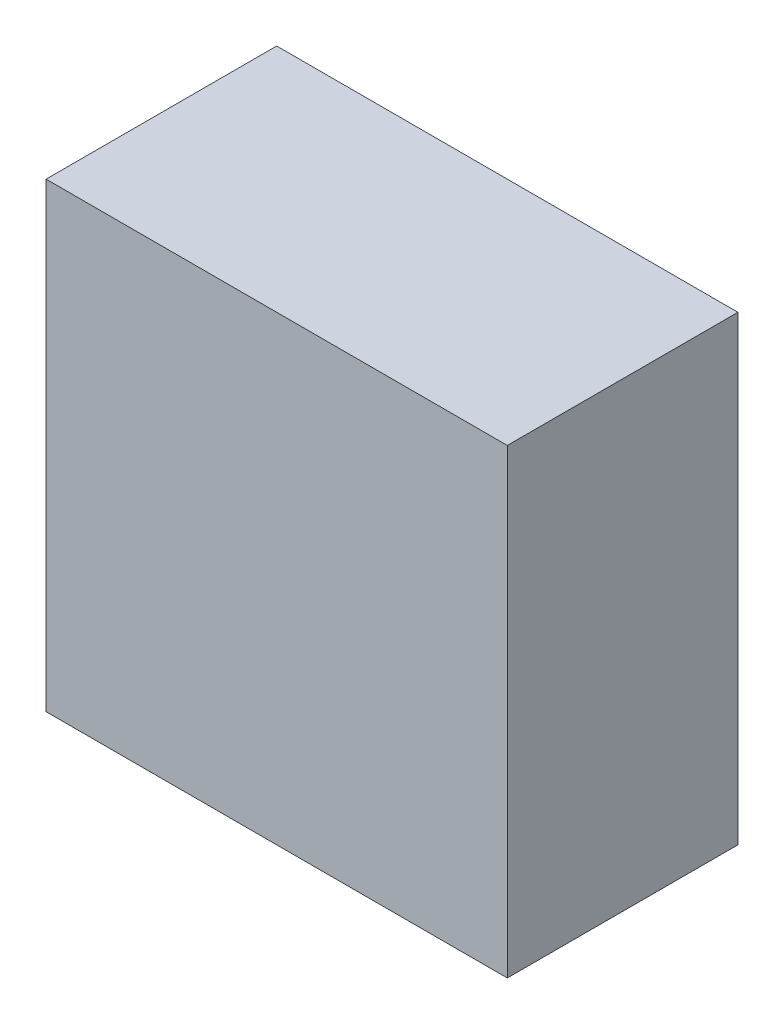
ISO-10303-21;
HEADER;
FILE_DESCRIPTION(('STEP AP214'),'2;1');
FILE_NAME('part.step','',(''),(''),'','','');
FILE_SCHEMA(('AUTOMOTIVE_DESIGN { 1 0 10303 214 1 1 1 1 }'));
ENDSEC;
DATA;
#1=APPLICATION_CONTEXT('core data for automotive mechanical design processes');
#2=APPLICATION_PROTOCOL_DEFINITION('international standard','automotive_design',2000,#1);
#3=PRODUCT_CONTEXT('',#1,'mechanical');
#4=PRODUCT('Part','Part','',(#3));
#5=PRODUCT_RELATED_PRODUCT_CATEGORY('part','',(#4));
#6=PRODUCT_DEFINITION_FORMATION('','',#4);
#7=PRODUCT_DEFINITION_CONTEXT('part definition',#1,'design');
#8=PRODUCT_DEFINITION('design','',#6,#7);
#9=PRODUCT_DEFINITION_SHAPE('','',#8);
#10=(LENGTH_UNIT() NAMED_UNIT(*) SI_UNIT(.MILLI.,.METRE.));
#11=(NAMED_UNIT(*) PLANE_ANGLE_UNIT() SI_UNIT($,.RADIAN.));
#12=(NAMED_UNIT(*) SI_UNIT($,.STERADIAN.) SOLID_ANGLE_UNIT());
#13=UNCERTAINTY_MEASURE_WITH_UNIT(LENGTH_MEASURE(1.E-05),#10,'distance_accuracy_value','');
#14=(GEOMETRIC_REPRESENTATION_CONTEXT(3) GLOBAL_UNCERTAINTY_ASSIGNED_CONTEXT((#13)) GLOBAL_UNIT_ASSIGNED_CONTEXT((#10,
#11,#12)) REPRESENTATION_CONTEXT('',''));
#15=CARTESIAN_POINT('',(0.,0.,0.));
#16=DIRECTION('',(0.,0.,1.));
#17=DIRECTION('',(1.,0.,0.));
#18=AXIS2_PLACEMENT_3D('',#15,#16,#17);
#19=CARTESIAN_POINT('',(0.,0.,150.));
#20=DIRECTION('',(1.,0.,0.));
#21=DIRECTION('',(0.,0.,-1.));
#22=AXIS2_PLACEMENT_3D('',#19,#20,#21);
#23=PLANE('',#22);
#24=DIRECTION('',(0.,-1.,0.));
#25=VECTOR('',#24,1.);
#26=CARTESIAN_POINT('',(0.,0.,0.));
#27=LINE('',#26,#25);
#28=CARTESIAN_POINT('',(0.,300.,0.));
#29=VERTEX_POINT('',#28);
#30=CARTESIAN_POINT('',(0.,0.,0.));
#31=VERTEX_POINT('',#30);
#32=EDGE_CURVE('E106',#29,#31,#27,.T.);
#33=ORIENTED_EDGE('',*,*,#32,.T.);
#34=DIRECTION('',(0.,0.,-1.));
#35=VECTOR('',#34,1.);
#36=CARTESIAN_POINT('',(0.,0.,150.));
#37=LINE('',#36,#35);
#38=CARTESIAN_POINT('',(0.,0.,150.));
#39=VERTEX_POINT('',#38);
#40=EDGE_CURVE('E11',#39,#31,#37,.T.);
#41=ORIENTED_EDGE('',*,*,#40,.F.);
#42=DIRECTION('',(0.,-1.,0.));
#43=VECTOR('',#42,1.);
#44=CARTESIAN_POINT('',(0.,0.,150.));
#45=LINE('',#44,#43);
#46=CARTESIAN_POINT('',(0.,300.,150.));
#47=VERTEX_POINT('',#46);
#48=EDGE_CURVE('E94',#47,#39,#45,.T.);
#49=ORIENTED_EDGE('',*,*,#48,.F.);
#50=DIRECTION('',(0.,0.,-1.));
#51=VECTOR('',#50,1.);
#52=CARTESIAN_POINT('',(0.,300.,150.));
#53=LINE('',#52,#51);
#54=EDGE_CURVE('E102',#47,#29,#53,.T.);
#55=ORIENTED_EDGE('',*,*,#54,.T.);
#56=EDGE_LOOP('',(#33,#41,#49,#55));
#57=FACE_BOUND('',#56,.T.);
#58=ADVANCED_FACE('F43',(#57),#23,.F.);
#59=CARTESIAN_POINT('',(0.,0.,150.));
#60=DIRECTION('',(0.,1.,0.));
#61=DIRECTION('',(0.,0.,1.));
#62=AXIS2_PLACEMENT_3D('',#59,#60,#61);
#63=PLANE('',#62);
#64=DIRECTION('',(1.,0.,0.));
#65=VECTOR('',#64,1.);
#66=CARTESIAN_POINT('',(0.,0.,0.));
#67=LINE('',#66,#65);
#68=CARTESIAN_POINT('',(300.,0.,0.));
#69=VERTEX_POINT('',#68);
#70=EDGE_CURVE('E98',#31,#69,#67,.T.);
#71=ORIENTED_EDGE('',*,*,#70,.T.);
#72=DIRECTION('',(0.,0.,-1.));
#73=VECTOR('',#72,1.);
#74=CARTESIAN_POINT('',(300.,0.,150.));
#75=LINE('',#74,#73);
#76=CARTESIAN_POINT('',(300.,0.,150.));
#77=VERTEX_POINT('',#76);
#78=EDGE_CURVE('E51',#77,#69,#75,.T.);
#79=ORIENTED_EDGE('',*,*,#78,.F.);
#80=DIRECTION('',(1.,0.,0.));
#81=VECTOR('',#80,1.);
#82=CARTESIAN_POINT('',(0.,0.,150.));
#83=LINE('',#82,#81);
#84=EDGE_CURVE('E89',#39,#77,#83,.T.);
#85=ORIENTED_EDGE('',*,*,#84,.F.);
#86=ORIENTED_EDGE('',*,*,#40,.T.);
#87=EDGE_LOOP('',(#71,#79,#85,#86));
#88=FACE_BOUND('',#87,.T.);
#89=ADVANCED_FACE('F97',(#88),#63,.F.);
#90=CARTESIAN_POINT('',(300.,0.,150.));
#91=DIRECTION('',(-1.,0.,0.));
#92=DIRECTION('',(0.,0.,1.));
#93=AXIS2_PLACEMENT_3D('',#90,#91,#92);
#94=PLANE('',#93);
#95=DIRECTION('',(0.,1.,0.));
#96=VECTOR('',#95,1.);
#97=CARTESIAN_POINT('',(300.,0.,0.));
#98=LINE('',#97,#96);
#99=CARTESIAN_POINT('',(300.,300.,0.));
#100=VERTEX_POINT('',#99);
#101=EDGE_CURVE('E76',#69,#100,#98,.T.);
#102=ORIENTED_EDGE('',*,*,#101,.T.);
#103=DIRECTION('',(0.,0.,-1.));
#104=VECTOR('',#103,1.);
#105=CARTESIAN_POINT('',(300.,300.,150.));
#106=LINE('',#105,#104);
#107=CARTESIAN_POINT('',(300.,300.,150.));
#108=VERTEX_POINT('',#107);
#109=EDGE_CURVE('E99',#108,#100,#106,.T.);
#110=ORIENTED_EDGE('',*,*,#109,.F.);
#111=DIRECTION('',(0.,1.,0.));
#112=VECTOR('',#111,1.);
#113=CARTESIAN_POINT('',(300.,0.,150.));
#114=LINE('',#113,#112);
#115=EDGE_CURVE('E92',#77,#108,#114,.T.);
#116=ORIENTED_EDGE('',*,*,#115,.F.);
#117=ORIENTED_EDGE('',*,*,#78,.T.);
#118=EDGE_LOOP('',(#102,#110,#116,#117));
#119=FACE_BOUND('',#118,.T.);
#120=ADVANCED_FACE('F100',(#119),#94,.F.);
#121=CARTESIAN_POINT('',(0.,300.,150.));
#122=DIRECTION('',(0.,-1.,0.));
#123=DIRECTION('',(0.,0.,-1.));
#124=AXIS2_PLACEMENT_3D('',#121,#122,#123);
#125=PLANE('',#124);
#126=DIRECTION('',(-1.,0.,0.));
#127=VECTOR('',#126,1.);
#128=CARTESIAN_POINT('',(0.,300.,0.));
#129=LINE('',#128,#127);
#130=EDGE_CURVE('E82',#100,#29,#129,.T.);
#131=ORIENTED_EDGE('',*,*,#130,.T.);
#132=ORIENTED_EDGE('',*,*,#54,.F.);
#133=DIRECTION('',(-1.,0.,0.));
#134=VECTOR('',#133,1.);
#135=CARTESIAN_POINT('',(0.,300.,150.));
#136=LINE('',#135,#134);
#137=EDGE_CURVE('E59',#108,#47,#136,.T.);
#138=ORIENTED_EDGE('',*,*,#137,.F.);
#139=ORIENTED_EDGE('',*,*,#109,.T.);
#140=EDGE_LOOP('',(#131,#132,#138,#139));
#141=FACE_BOUND('',#140,.T.);
#142=ADVANCED_FACE('F113',(#141),#125,.F.);
#143=CARTESIAN_POINT('',(0.,0.,150.));
#144=DIRECTION('',(0.,0.,-1.));
#145=DIRECTION('',(-1.,0.,0.));
#146=AXIS2_PLACEMENT_3D('',#143,#144,#145);
#147=PLANE('',#146);
#148=ORIENTED_EDGE('',*,*,#48,.T.);
#149=ORIENTED_EDGE('',*,*,#84,.T.);
#150=ORIENTED_EDGE('',*,*,#115,.T.);
#151=ORIENTED_EDGE('',*,*,#137,.T.);
#152=EDGE_LOOP('',(#148,#149,#150,#151));
#153=FACE_BOUND('',#152,.T.);
#154=ADVANCED_FACE('F90',(#153),#147,.F.);
#155=CARTESIAN_POINT('',(0.,0.,0.));
#156=DIRECTION('',(0.,0.,-1.));
#157=DIRECTION('',(-1.,0.,0.));
#158=AXIS2_PLACEMENT_3D('',#155,#156,#157);
#159=PLANE('',#158);
#160=ORIENTED_EDGE('',*,*,#32,.F.);
#161=ORIENTED_EDGE('',*,*,#130,.F.);
#162=ORIENTED_EDGE('',*,*,#101,.F.);
#163=ORIENTED_EDGE('',*,*,#70,.F.);
#164=EDGE_LOOP('',(#160,#161,#162,#163));
#165=FACE_BOUND('',#164,.T.);
#166=ADVANCED_FACE('F116',(#165),#159,.T.);
#167=CLOSED_SHELL('',(#58,#89,#120,#142,#154,#166));
#168=MANIFOLD_SOLID_BREP('B2',#167);
#169=ADVANCED_BREP_SHAPE_REPRESENTATION('',(#18,#168),#14);
#170=SHAPE_DEFINITION_REPRESENTATION(#9,#169);
ENDSEC;
END-ISO-10303-21;
